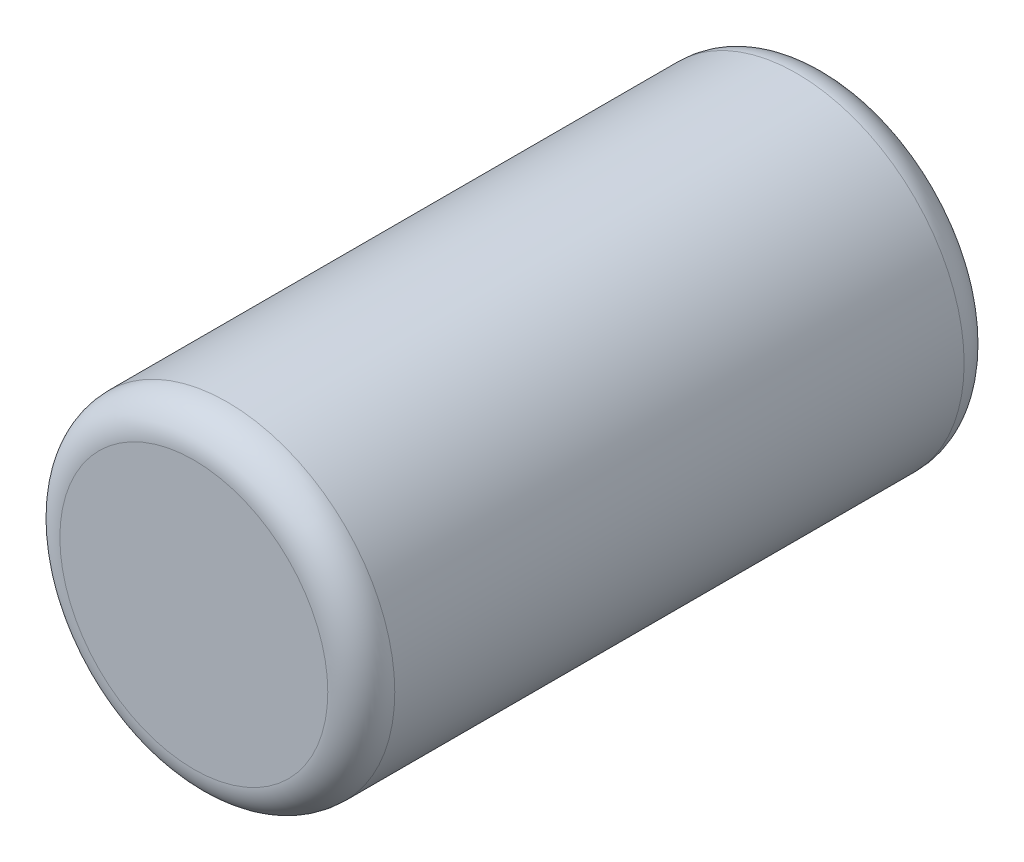
ISO-10303-21;
HEADER;
FILE_DESCRIPTION(('STEP AP214'),'2;1');
FILE_NAME('part.step','',(''),(''),'','','');
FILE_SCHEMA(('AUTOMOTIVE_DESIGN { 1 0 10303 214 1 1 1 1 }'));
ENDSEC;
DATA;
#1=APPLICATION_CONTEXT('core data for automotive mechanical design processes');
#2=APPLICATION_PROTOCOL_DEFINITION('international standard','automotive_design',2000,#1);
#3=PRODUCT_CONTEXT('',#1,'mechanical');
#4=PRODUCT('Part','Part','',(#3));
#5=PRODUCT_RELATED_PRODUCT_CATEGORY('part','',(#4));
#6=PRODUCT_DEFINITION_FORMATION('','',#4);
#7=PRODUCT_DEFINITION_CONTEXT('part definition',#1,'design');
#8=PRODUCT_DEFINITION('design','',#6,#7);
#9=PRODUCT_DEFINITION_SHAPE('','',#8);
#10=(LENGTH_UNIT() NAMED_UNIT(*) SI_UNIT(.MILLI.,.METRE.));
#11=(NAMED_UNIT(*) PLANE_ANGLE_UNIT() SI_UNIT($,.RADIAN.));
#12=(NAMED_UNIT(*) SI_UNIT($,.STERADIAN.) SOLID_ANGLE_UNIT());
#13=UNCERTAINTY_MEASURE_WITH_UNIT(LENGTH_MEASURE(1.E-05),#10,'distance_accuracy_value','');
#14=(GEOMETRIC_REPRESENTATION_CONTEXT(3) GLOBAL_UNCERTAINTY_ASSIGNED_CONTEXT((#13)) GLOBAL_UNIT_ASSIGNED_CONTEXT((#10,
#11,#12)) REPRESENTATION_CONTEXT('',''));
#15=CARTESIAN_POINT('',(0.,0.,0.));
#16=DIRECTION('',(0.,0.,1.));
#17=DIRECTION('',(1.,0.,0.));
#18=AXIS2_PLACEMENT_3D('',#15,#16,#17);
#19=CARTESIAN_POINT('',(0.,0.,9.5));
#20=DIRECTION('',(0.,0.,-1.));
#21=DIRECTION('',(-1.,0.,0.));
#22=AXIS2_PLACEMENT_3D('',#19,#20,#21);
#23=CYLINDRICAL_SURFACE('',#22,5.);
#24=CARTESIAN_POINT('',(0.,0.,-8.5));
#25=DIRECTION('',(0.,0.,1.));
#26=DIRECTION('',(1.,0.,0.));
#27=AXIS2_PLACEMENT_3D('',#24,#25,#26);
#28=CIRCLE('',#27,5.);
#29=CARTESIAN_POINT('',(5.,0.,-8.5));
#30=VERTEX_POINT('',#29);
#31=EDGE_CURVE('E42',#30,#30,#28,.T.);
#32=ORIENTED_EDGE('',*,*,#31,.T.);
#33=EDGE_LOOP('',(#32));
#34=FACE_BOUND('',#33,.T.);
#35=CARTESIAN_POINT('',(0.,0.,8.5));
#36=DIRECTION('',(0.,0.,1.));
#37=DIRECTION('',(1.,0.,0.));
#38=AXIS2_PLACEMENT_3D('',#35,#36,#37);
#39=CIRCLE('',#38,5.);
#40=CARTESIAN_POINT('',(5.,0.,8.5));
#41=VERTEX_POINT('',#40);
#42=EDGE_CURVE('E46',#41,#41,#39,.F.);
#43=ORIENTED_EDGE('',*,*,#42,.T.);
#44=EDGE_LOOP('',(#43));
#45=FACE_BOUND('',#44,.T.);
#46=ADVANCED_FACE('F31',(#34,#45),#23,.T.);
#47=CARTESIAN_POINT('',(0.,0.,9.5));
#48=DIRECTION('',(0.,0.,1.));
#49=DIRECTION('',(1.,0.,0.));
#50=AXIS2_PLACEMENT_3D('',#47,#48,#49);
#51=PLANE('',#50);
#52=CARTESIAN_POINT('',(0.,0.,9.5));
#53=DIRECTION('',(0.,0.,1.));
#54=DIRECTION('',(1.,0.,0.));
#55=AXIS2_PLACEMENT_3D('',#52,#53,#54);
#56=CIRCLE('',#55,4.);
#57=CARTESIAN_POINT('',(4.,0.,9.5));
#58=VERTEX_POINT('',#57);
#59=EDGE_CURVE('E10',#58,#58,#56,.T.);
#60=ORIENTED_EDGE('',*,*,#59,.T.);
#61=EDGE_LOOP('',(#60));
#62=FACE_BOUND('',#61,.T.);
#63=ADVANCED_FACE('F62',(#62),#51,.T.);
#64=CARTESIAN_POINT('',(0.,0.,-9.5));
#65=DIRECTION('',(0.,0.,1.));
#66=DIRECTION('',(1.,0.,0.));
#67=AXIS2_PLACEMENT_3D('',#64,#65,#66);
#68=PLANE('',#67);
#69=CARTESIAN_POINT('',(0.,0.,-9.5));
#70=DIRECTION('',(0.,0.,1.));
#71=DIRECTION('',(1.,0.,0.));
#72=AXIS2_PLACEMENT_3D('',#69,#70,#71);
#73=CIRCLE('',#72,4.);
#74=CARTESIAN_POINT('',(4.,0.,-9.5));
#75=VERTEX_POINT('',#74);
#76=EDGE_CURVE('E38',#75,#75,#73,.F.);
#77=ORIENTED_EDGE('',*,*,#76,.T.);
#78=EDGE_LOOP('',(#77));
#79=FACE_BOUND('',#78,.T.);
#80=ADVANCED_FACE('F59',(#79),#68,.F.);
#81=CARTESIAN_POINT('',(0.,0.,-8.5));
#82=DIRECTION('',(0.,0.,1.));
#83=DIRECTION('',(1.,0.,0.));
#84=AXIS2_PLACEMENT_3D('',#81,#82,#83);
#85=TOROIDAL_SURFACE('',#84,4.,1.);
#86=ORIENTED_EDGE('',*,*,#76,.F.);
#87=EDGE_LOOP('',(#86));
#88=FACE_BOUND('',#87,.T.);
#89=ORIENTED_EDGE('',*,*,#31,.F.);
#90=EDGE_LOOP('',(#89));
#91=FACE_BOUND('',#90,.T.);
#92=ADVANCED_FACE('F55',(#88,#91),#85,.T.);
#93=CARTESIAN_POINT('',(0.,0.,8.5));
#94=DIRECTION('',(0.,0.,1.));
#95=DIRECTION('',(1.,0.,0.));
#96=AXIS2_PLACEMENT_3D('',#93,#94,#95);
#97=TOROIDAL_SURFACE('',#96,4.,1.);
#98=ORIENTED_EDGE('',*,*,#42,.F.);
#99=EDGE_LOOP('',(#98));
#100=FACE_BOUND('',#99,.T.);
#101=ORIENTED_EDGE('',*,*,#59,.F.);
#102=EDGE_LOOP('',(#101));
#103=FACE_BOUND('',#102,.T.);
#104=ADVANCED_FACE('F33',(#100,#103),#97,.T.);
#105=CLOSED_SHELL('',(#46,#63,#80,#92,#104));
#106=MANIFOLD_SOLID_BREP('B2',#105);
#107=ADVANCED_BREP_SHAPE_REPRESENTATION('',(#18,#106),#14);
#108=SHAPE_DEFINITION_REPRESENTATION(#9,#107);
ENDSEC;
END-ISO-10303-21;
